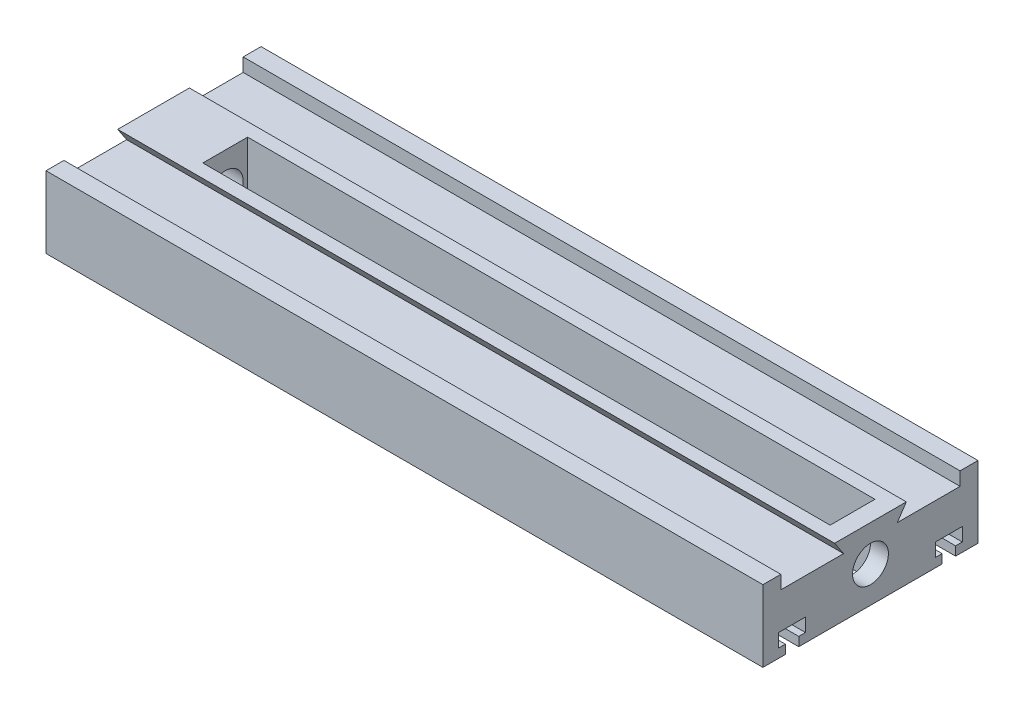
ISO-10303-21;
HEADER;
FILE_DESCRIPTION(('STEP AP214'),'2;1');
FILE_NAME('part.step','',(''),(''),'','','');
FILE_SCHEMA(('AUTOMOTIVE_DESIGN { 1 0 10303 214 1 1 1 1 }'));
ENDSEC;
DATA;
#1=APPLICATION_CONTEXT('core data for automotive mechanical design processes');
#2=APPLICATION_PROTOCOL_DEFINITION('international standard','automotive_design',2000,#1);
#3=PRODUCT_CONTEXT('',#1,'mechanical');
#4=PRODUCT('Part','Part','',(#3));
#5=PRODUCT_RELATED_PRODUCT_CATEGORY('part','',(#4));
#6=PRODUCT_DEFINITION_FORMATION('','',#4);
#7=PRODUCT_DEFINITION_CONTEXT('part definition',#1,'design');
#8=PRODUCT_DEFINITION('design','',#6,#7);
#9=PRODUCT_DEFINITION_SHAPE('','',#8);
#10=(LENGTH_UNIT() NAMED_UNIT(*) SI_UNIT(.MILLI.,.METRE.));
#11=(NAMED_UNIT(*) PLANE_ANGLE_UNIT() SI_UNIT($,.RADIAN.));
#12=(NAMED_UNIT(*) SI_UNIT($,.STERADIAN.) SOLID_ANGLE_UNIT());
#13=UNCERTAINTY_MEASURE_WITH_UNIT(LENGTH_MEASURE(1.E-05),#10,'distance_accuracy_value','');
#14=(GEOMETRIC_REPRESENTATION_CONTEXT(3) GLOBAL_UNCERTAINTY_ASSIGNED_CONTEXT((#13)) GLOBAL_UNIT_ASSIGNED_CONTEXT((#10,
#11,#12)) REPRESENTATION_CONTEXT('',''));
#15=CARTESIAN_POINT('',(0.,0.,0.));
#16=DIRECTION('',(0.,0.,1.));
#17=DIRECTION('',(1.,0.,0.));
#18=AXIS2_PLACEMENT_3D('',#15,#16,#17);
#19=CARTESIAN_POINT('',(-254.,0.,0.));
#20=DIRECTION('',(1.,0.,0.));
#21=DIRECTION('',(0.,0.,-1.));
#22=AXIS2_PLACEMENT_3D('',#19,#20,#21);
#23=CYLINDRICAL_SURFACE('',#22,12.7);
#24=CARTESIAN_POINT('',(-203.2,0.,0.));
#25=DIRECTION('',(-1.,0.,0.));
#26=DIRECTION('',(0.,0.,1.));
#27=AXIS2_PLACEMENT_3D('',#24,#25,#26);
#28=CIRCLE('',#27,12.7);
#29=CARTESIAN_POINT('',(-203.2,0.,12.7));
#30=VERTEX_POINT('',#29);
#31=EDGE_CURVE('E36',#30,#30,#28,.F.);
#32=ORIENTED_EDGE('',*,*,#31,.T.);
#33=EDGE_LOOP('',(#32));
#34=FACE_BOUND('',#33,.T.);
#35=CARTESIAN_POINT('',(-254.,0.,0.));
#36=DIRECTION('',(1.,0.,0.));
#37=DIRECTION('',(0.,0.,-1.));
#38=AXIS2_PLACEMENT_3D('',#35,#36,#37);
#39=CIRCLE('',#38,12.7);
#40=CARTESIAN_POINT('',(-254.,0.,-12.7));
#41=VERTEX_POINT('',#40);
#42=EDGE_CURVE('E332',#41,#41,#39,.T.);
#43=ORIENTED_EDGE('',*,*,#42,.F.);
#44=EDGE_LOOP('',(#43));
#45=FACE_BOUND('',#44,.T.);
#46=ADVANCED_FACE('F32',(#34,#45),#23,.F.);
#47=CARTESIAN_POINT('',(254.,25.4,76.2));
#48=DIRECTION('',(0.,-1.,0.));
#49=DIRECTION('',(0.,0.,-1.));
#50=AXIS2_PLACEMENT_3D('',#47,#48,#49);
#51=PLANE('',#50);
#52=DIRECTION('',(0.,0.,1.));
#53=VECTOR('',#52,1.);
#54=CARTESIAN_POINT('',(-254.,25.4,76.2));
#55=LINE('',#54,#53);
#56=CARTESIAN_POINT('',(-254.,25.4,-76.2));
#57=VERTEX_POINT('',#56);
#58=CARTESIAN_POINT('',(-254.,25.4,-63.5));
#59=VERTEX_POINT('',#58);
#60=EDGE_CURVE('E474',#57,#59,#55,.T.);
#61=ORIENTED_EDGE('',*,*,#60,.T.);
#62=DIRECTION('',(1.,0.,0.));
#63=VECTOR('',#62,1.);
#64=CARTESIAN_POINT('',(254.,25.4,-63.5));
#65=LINE('',#64,#63);
#66=CARTESIAN_POINT('',(254.,25.4,-63.5));
#67=VERTEX_POINT('',#66);
#68=EDGE_CURVE('E328',#59,#67,#65,.T.);
#69=ORIENTED_EDGE('',*,*,#68,.T.);
#70=DIRECTION('',(0.,0.,1.));
#71=VECTOR('',#70,1.);
#72=CARTESIAN_POINT('',(254.,25.4,76.2));
#73=LINE('',#72,#71);
#74=CARTESIAN_POINT('',(254.,25.4,-76.2));
#75=VERTEX_POINT('',#74);
#76=EDGE_CURVE('E459',#75,#67,#73,.T.);
#77=ORIENTED_EDGE('',*,*,#76,.F.);
#78=DIRECTION('',(-1.,0.,0.));
#79=VECTOR('',#78,1.);
#80=CARTESIAN_POINT('',(254.,25.4,-76.2));
#81=LINE('',#80,#79);
#82=EDGE_CURVE('E41',#75,#57,#81,.T.);
#83=ORIENTED_EDGE('',*,*,#82,.T.);
#84=EDGE_LOOP('',(#61,#69,#77,#83));
#85=FACE_BOUND('',#84,.T.);
#86=ADVANCED_FACE('F517',(#85),#51,.F.);
#87=DIRECTION('',(1.,0.,0.));
#88=VECTOR('',#87,1.);
#89=CARTESIAN_POINT('',(-203.2,25.4,15.875));
#90=LINE('',#89,#88);
#91=CARTESIAN_POINT('',(-203.2,25.4,15.875));
#92=VERTEX_POINT('',#91);
#93=CARTESIAN_POINT('',(241.3,25.4,15.875));
#94=VERTEX_POINT('',#93);
#95=EDGE_CURVE('E271',#92,#94,#90,.T.);
#96=ORIENTED_EDGE('',*,*,#95,.F.);
#97=DIRECTION('',(0.,0.,1.));
#98=VECTOR('',#97,1.);
#99=CARTESIAN_POINT('',(-203.2,25.4,15.875));
#100=LINE('',#99,#98);
#101=CARTESIAN_POINT('',(-203.2,25.4,-15.875));
#102=VERTEX_POINT('',#101);
#103=EDGE_CURVE('E49',#102,#92,#100,.T.);
#104=ORIENTED_EDGE('',*,*,#103,.F.);
#105=DIRECTION('',(-1.,0.,0.));
#106=VECTOR('',#105,1.);
#107=CARTESIAN_POINT('',(-203.2,25.4,-15.875));
#108=LINE('',#107,#106);
#109=CARTESIAN_POINT('',(241.3,25.4,-15.875));
#110=VERTEX_POINT('',#109);
#111=EDGE_CURVE('E262',#110,#102,#108,.T.);
#112=ORIENTED_EDGE('',*,*,#111,.F.);
#113=DIRECTION('',(0.,0.,-1.));
#114=VECTOR('',#113,1.);
#115=CARTESIAN_POINT('',(241.3,25.4,15.875));
#116=LINE('',#115,#114);
#117=EDGE_CURVE('E265',#94,#110,#116,.T.);
#118=ORIENTED_EDGE('',*,*,#117,.F.);
#119=EDGE_LOOP('',(#96,#104,#112,#118));
#120=FACE_BOUND('',#119,.T.);
#121=CARTESIAN_POINT('',(254.,25.4,-25.4));
#122=VERTEX_POINT('',#121);
#123=CARTESIAN_POINT('',(254.,25.4,25.4));
#124=VERTEX_POINT('',#123);
#125=EDGE_CURVE('E463',#122,#124,#73,.T.);
#126=ORIENTED_EDGE('',*,*,#125,.F.);
#127=DIRECTION('',(1.,0.,0.));
#128=VECTOR('',#127,1.);
#129=CARTESIAN_POINT('',(-254.,25.4,-25.4));
#130=LINE('',#129,#128);
#131=CARTESIAN_POINT('',(-254.,25.4,-25.4));
#132=VERTEX_POINT('',#131);
#133=EDGE_CURVE('E317',#132,#122,#130,.T.);
#134=ORIENTED_EDGE('',*,*,#133,.F.);
#135=CARTESIAN_POINT('',(-254.,25.4,25.4));
#136=VERTEX_POINT('',#135);
#137=EDGE_CURVE('E478',#132,#136,#55,.T.);
#138=ORIENTED_EDGE('',*,*,#137,.T.);
#139=DIRECTION('',(1.,0.,0.));
#140=VECTOR('',#139,1.);
#141=CARTESIAN_POINT('',(-254.,25.4,25.4));
#142=LINE('',#141,#140);
#143=EDGE_CURVE('E319',#136,#124,#142,.T.);
#144=ORIENTED_EDGE('',*,*,#143,.T.);
#145=EDGE_LOOP('',(#126,#134,#138,#144));
#146=FACE_BOUND('',#145,.T.);
#147=ADVANCED_FACE('F524',(#120,#146),#51,.F.);
#148=CARTESIAN_POINT('',(254.,-25.4,76.2));
#149=DIRECTION('',(0.,1.,0.));
#150=DIRECTION('',(0.,0.,1.));
#151=AXIS2_PLACEMENT_3D('',#148,#149,#150);
#152=PLANE('',#151);
#153=DIRECTION('',(-1.,0.,0.));
#154=VECTOR('',#153,1.);
#155=CARTESIAN_POINT('',(-203.2,-25.4,-15.875));
#156=LINE('',#155,#154);
#157=CARTESIAN_POINT('',(241.3,-25.4,-15.875));
#158=VERTEX_POINT('',#157);
#159=CARTESIAN_POINT('',(-203.2,-25.4,-15.875));
#160=VERTEX_POINT('',#159);
#161=EDGE_CURVE('E252',#158,#160,#156,.T.);
#162=ORIENTED_EDGE('',*,*,#161,.T.);
#163=DIRECTION('',(0.,0.,1.));
#164=VECTOR('',#163,1.);
#165=CARTESIAN_POINT('',(-203.2,-25.4,15.875));
#166=LINE('',#165,#164);
#167=CARTESIAN_POINT('',(-203.2,-25.4,15.875));
#168=VERTEX_POINT('',#167);
#169=EDGE_CURVE('E246',#160,#168,#166,.T.);
#170=ORIENTED_EDGE('',*,*,#169,.T.);
#171=DIRECTION('',(1.,0.,0.));
#172=VECTOR('',#171,1.);
#173=CARTESIAN_POINT('',(-203.2,-25.4,15.875));
#174=LINE('',#173,#172);
#175=CARTESIAN_POINT('',(241.3,-25.4,15.875));
#176=VERTEX_POINT('',#175);
#177=EDGE_CURVE('E255',#168,#176,#174,.T.);
#178=ORIENTED_EDGE('',*,*,#177,.T.);
#179=DIRECTION('',(0.,0.,-1.));
#180=VECTOR('',#179,1.);
#181=CARTESIAN_POINT('',(241.3,-25.4,15.875));
#182=LINE('',#181,#180);
#183=EDGE_CURVE('E57',#176,#158,#182,.T.);
#184=ORIENTED_EDGE('',*,*,#183,.T.);
#185=EDGE_LOOP('',(#162,#170,#178,#184));
#186=FACE_BOUND('',#185,.T.);
#187=DIRECTION('',(0.,0.,-1.));
#188=VECTOR('',#187,1.);
#189=CARTESIAN_POINT('',(-254.,-25.4,76.2));
#190=LINE('',#189,#188);
#191=CARTESIAN_POINT('',(-254.,-25.4,50.8));
#192=VERTEX_POINT('',#191);
#193=CARTESIAN_POINT('',(-254.,-25.4,-50.8));
#194=VERTEX_POINT('',#193);
#195=EDGE_CURVE('E483',#192,#194,#190,.T.);
#196=ORIENTED_EDGE('',*,*,#195,.T.);
#197=DIRECTION('',(1.,0.,0.));
#198=VECTOR('',#197,1.);
#199=CARTESIAN_POINT('',(-254.,-25.4,-50.8));
#200=LINE('',#199,#198);
#201=CARTESIAN_POINT('',(254.,-25.4,-50.8));
#202=VERTEX_POINT('',#201);
#203=EDGE_CURVE('E360',#194,#202,#200,.T.);
#204=ORIENTED_EDGE('',*,*,#203,.T.);
#205=DIRECTION('',(0.,0.,-1.));
#206=VECTOR('',#205,1.);
#207=CARTESIAN_POINT('',(254.,-25.4,76.2));
#208=LINE('',#207,#206);
#209=CARTESIAN_POINT('',(254.,-25.4,50.8));
#210=VERTEX_POINT('',#209);
#211=EDGE_CURVE('E470',#210,#202,#208,.T.);
#212=ORIENTED_EDGE('',*,*,#211,.F.);
#213=DIRECTION('',(1.,0.,0.));
#214=VECTOR('',#213,1.);
#215=CARTESIAN_POINT('',(-254.,-25.4,50.8));
#216=LINE('',#215,#214);
#217=EDGE_CURVE('E418',#192,#210,#216,.T.);
#218=ORIENTED_EDGE('',*,*,#217,.F.);
#219=EDGE_LOOP('',(#196,#204,#212,#218));
#220=FACE_BOUND('',#219,.T.);
#221=ADVANCED_FACE('F259',(#186,#220),#152,.F.);
#222=CARTESIAN_POINT('',(-254.,-25.4,76.2));
#223=VERTEX_POINT('',#222);
#224=CARTESIAN_POINT('',(-254.,-25.4,60.325));
#225=VERTEX_POINT('',#224);
#226=EDGE_CURVE('E458',#223,#225,#190,.T.);
#227=ORIENTED_EDGE('',*,*,#226,.T.);
#228=DIRECTION('',(1.,0.,0.));
#229=VECTOR('',#228,1.);
#230=CARTESIAN_POINT('',(-254.,-25.4,60.325));
#231=LINE('',#230,#229);
#232=CARTESIAN_POINT('',(254.,-25.4,60.325));
#233=VERTEX_POINT('',#232);
#234=EDGE_CURVE('E437',#225,#233,#231,.T.);
#235=ORIENTED_EDGE('',*,*,#234,.T.);
#236=CARTESIAN_POINT('',(254.,-25.4,76.2));
#237=VERTEX_POINT('',#236);
#238=EDGE_CURVE('E466',#237,#233,#208,.T.);
#239=ORIENTED_EDGE('',*,*,#238,.F.);
#240=DIRECTION('',(-1.,0.,0.));
#241=VECTOR('',#240,1.);
#242=CARTESIAN_POINT('',(254.,-25.4,76.2));
#243=LINE('',#242,#241);
#244=EDGE_CURVE('E486',#237,#223,#243,.T.);
#245=ORIENTED_EDGE('',*,*,#244,.T.);
#246=EDGE_LOOP('',(#227,#235,#239,#245));
#247=FACE_BOUND('',#246,.T.);
#248=ADVANCED_FACE('F563',(#247),#152,.F.);
#249=CARTESIAN_POINT('',(254.,25.4,-76.2));
#250=DIRECTION('',(0.,0.,1.));
#251=DIRECTION('',(0.,-1.,0.));
#252=AXIS2_PLACEMENT_3D('',#249,#250,#251);
#253=PLANE('',#252);
#254=DIRECTION('',(0.,1.,0.));
#255=VECTOR('',#254,1.);
#256=CARTESIAN_POINT('',(-254.,25.4,-76.2));
#257=LINE('',#256,#255);
#258=CARTESIAN_POINT('',(-254.,-25.4,-76.2));
#259=VERTEX_POINT('',#258);
#260=EDGE_CURVE('E440',#259,#57,#257,.T.);
#261=ORIENTED_EDGE('',*,*,#260,.T.);
#262=ORIENTED_EDGE('',*,*,#82,.F.);
#263=DIRECTION('',(0.,1.,0.));
#264=VECTOR('',#263,1.);
#265=CARTESIAN_POINT('',(254.,25.4,-76.2));
#266=LINE('',#265,#264);
#267=CARTESIAN_POINT('',(254.,-25.4,-76.2));
#268=VERTEX_POINT('',#267);
#269=EDGE_CURVE('E454',#268,#75,#266,.T.);
#270=ORIENTED_EDGE('',*,*,#269,.F.);
#271=DIRECTION('',(-1.,0.,0.));
#272=VECTOR('',#271,1.);
#273=CARTESIAN_POINT('',(254.,-25.4,-76.2));
#274=LINE('',#273,#272);
#275=EDGE_CURVE('E469',#268,#259,#274,.T.);
#276=ORIENTED_EDGE('',*,*,#275,.T.);
#277=EDGE_LOOP('',(#261,#262,#270,#276));
#278=FACE_BOUND('',#277,.T.);
#279=ADVANCED_FACE('F34',(#278),#253,.F.);
#280=CARTESIAN_POINT('',(254.,25.4,63.5000000000001));
#281=VERTEX_POINT('',#280);
#282=CARTESIAN_POINT('',(254.,25.4,76.2));
#283=VERTEX_POINT('',#282);
#284=EDGE_CURVE('E457',#281,#283,#73,.T.);
#285=ORIENTED_EDGE('',*,*,#284,.F.);
#286=DIRECTION('',(-1.,0.,0.));
#287=VECTOR('',#286,1.);
#288=CARTESIAN_POINT('',(254.,25.4,63.5000000000001));
#289=LINE('',#288,#287);
#290=CARTESIAN_POINT('',(-254.,25.4,63.5000000000001));
#291=VERTEX_POINT('',#290);
#292=EDGE_CURVE('E314',#281,#291,#289,.T.);
#293=ORIENTED_EDGE('',*,*,#292,.T.);
#294=CARTESIAN_POINT('',(-254.,25.4,76.2));
#295=VERTEX_POINT('',#294);
#296=EDGE_CURVE('E473',#291,#295,#55,.T.);
#297=ORIENTED_EDGE('',*,*,#296,.T.);
#298=DIRECTION('',(-1.,0.,0.));
#299=VECTOR('',#298,1.);
#300=CARTESIAN_POINT('',(254.,25.4,76.2));
#301=LINE('',#300,#299);
#302=EDGE_CURVE('E489',#283,#295,#301,.T.);
#303=ORIENTED_EDGE('',*,*,#302,.F.);
#304=EDGE_LOOP('',(#285,#293,#297,#303));
#305=FACE_BOUND('',#304,.T.);
#306=ADVANCED_FACE('F526',(#305),#51,.F.);
#307=CARTESIAN_POINT('',(254.,25.4,76.2));
#308=DIRECTION('',(0.,0.,-1.));
#309=DIRECTION('',(-1.,0.,0.));
#310=AXIS2_PLACEMENT_3D('',#307,#308,#309);
#311=PLANE('',#310);
#312=DIRECTION('',(0.,-1.,0.));
#313=VECTOR('',#312,1.);
#314=CARTESIAN_POINT('',(-254.,25.4,76.2));
#315=LINE('',#314,#313);
#316=EDGE_CURVE('E477',#295,#223,#315,.T.);
#317=ORIENTED_EDGE('',*,*,#316,.T.);
#318=ORIENTED_EDGE('',*,*,#244,.F.);
#319=DIRECTION('',(0.,-1.,0.));
#320=VECTOR('',#319,1.);
#321=CARTESIAN_POINT('',(254.,25.4,76.2));
#322=LINE('',#321,#320);
#323=EDGE_CURVE('E462',#283,#237,#322,.T.);
#324=ORIENTED_EDGE('',*,*,#323,.F.);
#325=ORIENTED_EDGE('',*,*,#302,.T.);
#326=EDGE_LOOP('',(#317,#318,#324,#325));
#327=FACE_BOUND('',#326,.T.);
#328=ADVANCED_FACE('F560',(#327),#311,.F.);
#329=CARTESIAN_POINT('',(254.,-25.4,-60.325));
#330=VERTEX_POINT('',#329);
#331=EDGE_CURVE('E465',#330,#268,#208,.T.);
#332=ORIENTED_EDGE('',*,*,#331,.F.);
#333=DIRECTION('',(1.,0.,0.));
#334=VECTOR('',#333,1.);
#335=CARTESIAN_POINT('',(-254.,-25.4,-60.325));
#336=LINE('',#335,#334);
#337=CARTESIAN_POINT('',(-254.,-25.4,-60.325));
#338=VERTEX_POINT('',#337);
#339=EDGE_CURVE('E392',#338,#330,#336,.T.);
#340=ORIENTED_EDGE('',*,*,#339,.F.);
#341=EDGE_CURVE('E480',#338,#259,#190,.T.);
#342=ORIENTED_EDGE('',*,*,#341,.T.);
#343=ORIENTED_EDGE('',*,*,#275,.F.);
#344=EDGE_LOOP('',(#332,#340,#342,#343));
#345=FACE_BOUND('',#344,.T.);
#346=ADVANCED_FACE('F549',(#345),#152,.F.);
#347=CARTESIAN_POINT('',(254.,0.,0.));
#348=DIRECTION('',(1.,0.,0.));
#349=DIRECTION('',(0.,0.,-1.));
#350=AXIS2_PLACEMENT_3D('',#347,#348,#349);
#351=PLANE('',#350);
#352=DIRECTION('',(0.,1.,0.));
#353=VECTOR('',#352,1.);
#354=CARTESIAN_POINT('',(254.,34.925,-63.5));
#355=LINE('',#354,#353);
#356=CARTESIAN_POINT('',(254.,15.875,-63.5));
#357=VERTEX_POINT('',#356);
#358=EDGE_CURVE('E285',#357,#67,#355,.T.);
#359=ORIENTED_EDGE('',*,*,#358,.F.);
#360=DIRECTION('',(0.,0.,-1.));
#361=VECTOR('',#360,1.);
#362=CARTESIAN_POINT('',(254.,15.875,-19.05));
#363=LINE('',#362,#361);
#364=CARTESIAN_POINT('',(254.,15.875,-19.05));
#365=VERTEX_POINT('',#364);
#366=EDGE_CURVE('E308',#365,#357,#363,.T.);
#367=ORIENTED_EDGE('',*,*,#366,.F.);
#368=DIRECTION('',(0.,-0.832050294337844,0.554700196225229));
#369=VECTOR('',#368,1.);
#370=CARTESIAN_POINT('',(254.,25.4,-25.4));
#371=LINE('',#370,#369);
#372=EDGE_CURVE('E305',#122,#365,#371,.T.);
#373=ORIENTED_EDGE('',*,*,#372,.F.);
#374=ORIENTED_EDGE('',*,*,#125,.T.);
#375=DIRECTION('',(0.,0.832050294337844,0.554700196225229));
#376=VECTOR('',#375,1.);
#377=CARTESIAN_POINT('',(254.,15.875,19.05));
#378=LINE('',#377,#376);
#379=CARTESIAN_POINT('',(254.,15.875,19.05));
#380=VERTEX_POINT('',#379);
#381=EDGE_CURVE('E303',#380,#124,#378,.T.);
#382=ORIENTED_EDGE('',*,*,#381,.F.);
#383=DIRECTION('',(0.,0.,-1.));
#384=VECTOR('',#383,1.);
#385=CARTESIAN_POINT('',(254.,15.875,63.5000000000001));
#386=LINE('',#385,#384);
#387=CARTESIAN_POINT('',(254.,15.875,63.5000000000001));
#388=VERTEX_POINT('',#387);
#389=EDGE_CURVE('E300',#388,#380,#386,.T.);
#390=ORIENTED_EDGE('',*,*,#389,.F.);
#391=DIRECTION('',(0.,-1.,0.));
#392=VECTOR('',#391,1.);
#393=CARTESIAN_POINT('',(254.,25.4,63.5000000000001));
#394=LINE('',#393,#392);
#395=EDGE_CURVE('E298',#281,#388,#394,.T.);
#396=ORIENTED_EDGE('',*,*,#395,.F.);
#397=ORIENTED_EDGE('',*,*,#284,.T.);
#398=ORIENTED_EDGE('',*,*,#323,.T.);
#399=ORIENTED_EDGE('',*,*,#238,.T.);
#400=DIRECTION('',(0.,-1.,0.));
#401=VECTOR('',#400,1.);
#402=CARTESIAN_POINT('',(254.,-25.4,60.325));
#403=LINE('',#402,#401);
#404=CARTESIAN_POINT('',(254.,-19.05,60.325));
#405=VERTEX_POINT('',#404);
#406=EDGE_CURVE('E400',#405,#233,#403,.T.);
#407=ORIENTED_EDGE('',*,*,#406,.F.);
#408=DIRECTION('',(0.,0.,-1.));
#409=VECTOR('',#408,1.);
#410=CARTESIAN_POINT('',(254.,-19.05,60.325));
#411=LINE('',#410,#409);
#412=CARTESIAN_POINT('',(254.,-19.05,65.0875));
#413=VERTEX_POINT('',#412);
#414=EDGE_CURVE('E433',#413,#405,#411,.T.);
#415=ORIENTED_EDGE('',*,*,#414,.F.);
#416=DIRECTION('',(0.,-1.,0.));
#417=VECTOR('',#416,1.);
#418=CARTESIAN_POINT('',(254.,-19.05,65.0875));
#419=LINE('',#418,#417);
#420=CARTESIAN_POINT('',(254.,-9.52499999999998,65.0875));
#421=VERTEX_POINT('',#420);
#422=EDGE_CURVE('E430',#421,#413,#419,.T.);
#423=ORIENTED_EDGE('',*,*,#422,.F.);
#424=DIRECTION('',(0.,0.,1.));
#425=VECTOR('',#424,1.);
#426=CARTESIAN_POINT('',(254.,-9.52499999999998,65.0875));
#427=LINE('',#426,#425);
#428=CARTESIAN_POINT('',(254.,-9.52499999999998,46.0375));
#429=VERTEX_POINT('',#428);
#430=EDGE_CURVE('E427',#429,#421,#427,.T.);
#431=ORIENTED_EDGE('',*,*,#430,.F.);
#432=DIRECTION('',(0.,1.,0.));
#433=VECTOR('',#432,1.);
#434=CARTESIAN_POINT('',(254.,-9.52499999999998,46.0375));
#435=LINE('',#434,#433);
#436=CARTESIAN_POINT('',(254.,-19.05,46.0375));
#437=VERTEX_POINT('',#436);
#438=EDGE_CURVE('E424',#437,#429,#435,.T.);
#439=ORIENTED_EDGE('',*,*,#438,.F.);
#440=DIRECTION('',(0.,0.,-1.));
#441=VECTOR('',#440,1.);
#442=CARTESIAN_POINT('',(254.,-19.05,46.0375));
#443=LINE('',#442,#441);
#444=CARTESIAN_POINT('',(254.,-19.05,50.8));
#445=VERTEX_POINT('',#444);
#446=EDGE_CURVE('E421',#445,#437,#443,.T.);
#447=ORIENTED_EDGE('',*,*,#446,.F.);
#448=DIRECTION('',(0.,1.,0.));
#449=VECTOR('',#448,1.);
#450=CARTESIAN_POINT('',(254.,-19.05,50.8));
#451=LINE('',#450,#449);
#452=EDGE_CURVE('E381',#210,#445,#451,.T.);
#453=ORIENTED_EDGE('',*,*,#452,.F.);
#454=ORIENTED_EDGE('',*,*,#211,.T.);
#455=DIRECTION('',(0.,-1.,0.));
#456=VECTOR('',#455,1.);
#457=CARTESIAN_POINT('',(254.,-19.05,-50.8));
#458=LINE('',#457,#456);
#459=CARTESIAN_POINT('',(254.,-19.05,-50.8));
#460=VERTEX_POINT('',#459);
#461=EDGE_CURVE('E335',#460,#202,#458,.T.);
#462=ORIENTED_EDGE('',*,*,#461,.F.);
#463=DIRECTION('',(0.,0.,-1.));
#464=VECTOR('',#463,1.);
#465=CARTESIAN_POINT('',(254.,-19.05,-46.0375));
#466=LINE('',#465,#464);
#467=CARTESIAN_POINT('',(254.,-19.05,-46.0375));
#468=VERTEX_POINT('',#467);
#469=EDGE_CURVE('E342',#468,#460,#466,.T.);
#470=ORIENTED_EDGE('',*,*,#469,.F.);
#471=DIRECTION('',(0.,-1.,0.));
#472=VECTOR('',#471,1.);
#473=CARTESIAN_POINT('',(254.,-9.52499999999997,-46.0375));
#474=LINE('',#473,#472);
#475=CARTESIAN_POINT('',(254.,-9.52499999999997,-46.0375));
#476=VERTEX_POINT('',#475);
#477=EDGE_CURVE('E374',#476,#468,#474,.T.);
#478=ORIENTED_EDGE('',*,*,#477,.F.);
#479=DIRECTION('',(0.,0.,1.));
#480=VECTOR('',#479,1.);
#481=CARTESIAN_POINT('',(254.,-9.52499999999997,-65.0875));
#482=LINE('',#481,#480);
#483=CARTESIAN_POINT('',(254.,-9.52499999999997,-65.0875));
#484=VERTEX_POINT('',#483);
#485=EDGE_CURVE('E371',#484,#476,#482,.T.);
#486=ORIENTED_EDGE('',*,*,#485,.F.);
#487=DIRECTION('',(0.,1.,0.));
#488=VECTOR('',#487,1.);
#489=CARTESIAN_POINT('',(254.,-19.05,-65.0875));
#490=LINE('',#489,#488);
#491=CARTESIAN_POINT('',(254.,-19.05,-65.0875));
#492=VERTEX_POINT('',#491);
#493=EDGE_CURVE('E368',#492,#484,#490,.T.);
#494=ORIENTED_EDGE('',*,*,#493,.F.);
#495=DIRECTION('',(0.,0.,-1.));
#496=VECTOR('',#495,1.);
#497=CARTESIAN_POINT('',(254.,-19.05,-60.325));
#498=LINE('',#497,#496);
#499=CARTESIAN_POINT('',(254.,-19.05,-60.325));
#500=VERTEX_POINT('',#499);
#501=EDGE_CURVE('E365',#500,#492,#498,.T.);
#502=ORIENTED_EDGE('',*,*,#501,.F.);
#503=DIRECTION('',(0.,1.,0.));
#504=VECTOR('',#503,1.);
#505=CARTESIAN_POINT('',(254.,-25.4,-60.325));
#506=LINE('',#505,#504);
#507=EDGE_CURVE('E362',#330,#500,#506,.T.);
#508=ORIENTED_EDGE('',*,*,#507,.F.);
#509=ORIENTED_EDGE('',*,*,#331,.T.);
#510=ORIENTED_EDGE('',*,*,#269,.T.);
#511=ORIENTED_EDGE('',*,*,#76,.T.);
#512=EDGE_LOOP('',(#359,#367,#373,#374,#382,#390,#396,#397,#398,#399,#407,#415,#423,#431,#439,
#447,#453,#454,#462,#470,#478,#486,#494,#502,#508,#509,#510,#511));
#513=FACE_BOUND('',#512,.T.);
#514=CARTESIAN_POINT('',(254.,0.,0.));
#515=DIRECTION('',(1.,0.,0.));
#516=DIRECTION('',(0.,0.,-1.));
#517=AXIS2_PLACEMENT_3D('',#514,#515,#516);
#518=CIRCLE('',#517,12.7);
#519=CARTESIAN_POINT('',(254.,0.,-12.7));
#520=VERTEX_POINT('',#519);
#521=EDGE_CURVE('E331',#520,#520,#518,.T.);
#522=ORIENTED_EDGE('',*,*,#521,.F.);
#523=EDGE_LOOP('',(#522));
#524=FACE_BOUND('',#523,.T.);
#525=ADVANCED_FACE('F546',(#513,#524),#351,.T.);
#526=CARTESIAN_POINT('',(-254.,0.,0.));
#527=DIRECTION('',(1.,0.,0.));
#528=DIRECTION('',(0.,0.,-1.));
#529=AXIS2_PLACEMENT_3D('',#526,#527,#528);
#530=PLANE('',#529);
#531=ORIENTED_EDGE('',*,*,#42,.T.);
#532=EDGE_LOOP('',(#531));
#533=FACE_BOUND('',#532,.T.);
#534=DIRECTION('',(0.,0.,-1.));
#535=VECTOR('',#534,1.);
#536=CARTESIAN_POINT('',(-254.,15.875,-19.05));
#537=LINE('',#536,#535);
#538=CARTESIAN_POINT('',(-254.,15.875,-19.05));
#539=VERTEX_POINT('',#538);
#540=CARTESIAN_POINT('',(-254.,15.875,-63.5));
#541=VERTEX_POINT('',#540);
#542=EDGE_CURVE('E291',#539,#541,#537,.T.);
#543=ORIENTED_EDGE('',*,*,#542,.T.);
#544=DIRECTION('',(0.,1.,0.));
#545=VECTOR('',#544,1.);
#546=CARTESIAN_POINT('',(-254.,15.875,-63.5));
#547=LINE('',#546,#545);
#548=EDGE_CURVE('E294',#541,#59,#547,.T.);
#549=ORIENTED_EDGE('',*,*,#548,.T.);
#550=ORIENTED_EDGE('',*,*,#60,.F.);
#551=ORIENTED_EDGE('',*,*,#260,.F.);
#552=ORIENTED_EDGE('',*,*,#341,.F.);
#553=DIRECTION('',(0.,1.,0.));
#554=VECTOR('',#553,1.);
#555=CARTESIAN_POINT('',(-254.,-25.4,-60.325));
#556=LINE('',#555,#554);
#557=CARTESIAN_POINT('',(-254.,-19.05,-60.325));
#558=VERTEX_POINT('',#557);
#559=EDGE_CURVE('E341',#338,#558,#556,.T.);
#560=ORIENTED_EDGE('',*,*,#559,.T.);
#561=DIRECTION('',(0.,0.,-1.));
#562=VECTOR('',#561,1.);
#563=CARTESIAN_POINT('',(-254.,-19.05,-60.325));
#564=LINE('',#563,#562);
#565=CARTESIAN_POINT('',(-254.,-19.05,-65.0875));
#566=VERTEX_POINT('',#565);
#567=EDGE_CURVE('E345',#558,#566,#564,.T.);
#568=ORIENTED_EDGE('',*,*,#567,.T.);
#569=DIRECTION('',(0.,1.,0.));
#570=VECTOR('',#569,1.);
#571=CARTESIAN_POINT('',(-254.,-19.05,-65.0875));
#572=LINE('',#571,#570);
#573=CARTESIAN_POINT('',(-254.,-9.52499999999997,-65.0875));
#574=VERTEX_POINT('',#573);
#575=EDGE_CURVE('E348',#566,#574,#572,.T.);
#576=ORIENTED_EDGE('',*,*,#575,.T.);
#577=DIRECTION('',(0.,0.,1.));
#578=VECTOR('',#577,1.);
#579=CARTESIAN_POINT('',(-254.,-9.52499999999997,-65.0875));
#580=LINE('',#579,#578);
#581=CARTESIAN_POINT('',(-254.,-9.52499999999997,-46.0375));
#582=VERTEX_POINT('',#581);
#583=EDGE_CURVE('E351',#574,#582,#580,.T.);
#584=ORIENTED_EDGE('',*,*,#583,.T.);
#585=DIRECTION('',(0.,-1.,0.));
#586=VECTOR('',#585,1.);
#587=CARTESIAN_POINT('',(-254.,-9.52499999999997,-46.0375));
#588=LINE('',#587,#586);
#589=CARTESIAN_POINT('',(-254.,-19.05,-46.0375));
#590=VERTEX_POINT('',#589);
#591=EDGE_CURVE('E354',#582,#590,#588,.T.);
#592=ORIENTED_EDGE('',*,*,#591,.T.);
#593=DIRECTION('',(0.,0.,-1.));
#594=VECTOR('',#593,1.);
#595=CARTESIAN_POINT('',(-254.,-19.05,-46.0375));
#596=LINE('',#595,#594);
#597=CARTESIAN_POINT('',(-254.,-19.05,-50.8));
#598=VERTEX_POINT('',#597);
#599=EDGE_CURVE('E357',#590,#598,#596,.T.);
#600=ORIENTED_EDGE('',*,*,#599,.T.);
#601=DIRECTION('',(0.,-1.,0.));
#602=VECTOR('',#601,1.);
#603=CARTESIAN_POINT('',(-254.,-19.05,-50.8));
#604=LINE('',#603,#602);
#605=EDGE_CURVE('E338',#598,#194,#604,.T.);
#606=ORIENTED_EDGE('',*,*,#605,.T.);
#607=ORIENTED_EDGE('',*,*,#195,.F.);
#608=DIRECTION('',(0.,1.,0.));
#609=VECTOR('',#608,1.);
#610=CARTESIAN_POINT('',(-254.,-19.05,50.8));
#611=LINE('',#610,#609);
#612=CARTESIAN_POINT('',(-254.,-19.05,50.8));
#613=VERTEX_POINT('',#612);
#614=EDGE_CURVE('E396',#192,#613,#611,.T.);
#615=ORIENTED_EDGE('',*,*,#614,.T.);
#616=DIRECTION('',(0.,0.,-1.));
#617=VECTOR('',#616,1.);
#618=CARTESIAN_POINT('',(-254.,-19.05,46.0375));
#619=LINE('',#618,#617);
#620=CARTESIAN_POINT('',(-254.,-19.05,46.0375));
#621=VERTEX_POINT('',#620);
#622=EDGE_CURVE('E399',#613,#621,#619,.T.);
#623=ORIENTED_EDGE('',*,*,#622,.T.);
#624=DIRECTION('',(0.,1.,0.));
#625=VECTOR('',#624,1.);
#626=CARTESIAN_POINT('',(-254.,-9.52499999999998,46.0375));
#627=LINE('',#626,#625);
#628=CARTESIAN_POINT('',(-254.,-9.52499999999998,46.0375));
#629=VERTEX_POINT('',#628);
#630=EDGE_CURVE('E403',#621,#629,#627,.T.);
#631=ORIENTED_EDGE('',*,*,#630,.T.);
#632=DIRECTION('',(0.,0.,1.));
#633=VECTOR('',#632,1.);
#634=CARTESIAN_POINT('',(-254.,-9.52499999999998,65.0875));
#635=LINE('',#634,#633);
#636=CARTESIAN_POINT('',(-254.,-9.52499999999998,65.0875));
#637=VERTEX_POINT('',#636);
#638=EDGE_CURVE('E406',#629,#637,#635,.T.);
#639=ORIENTED_EDGE('',*,*,#638,.T.);
#640=DIRECTION('',(0.,-1.,0.));
#641=VECTOR('',#640,1.);
#642=CARTESIAN_POINT('',(-254.,-19.05,65.0875));
#643=LINE('',#642,#641);
#644=CARTESIAN_POINT('',(-254.,-19.05,65.0875));
#645=VERTEX_POINT('',#644);
#646=EDGE_CURVE('E409',#637,#645,#643,.T.);
#647=ORIENTED_EDGE('',*,*,#646,.T.);
#648=DIRECTION('',(0.,0.,-1.));
#649=VECTOR('',#648,1.);
#650=CARTESIAN_POINT('',(-254.,-19.05,60.325));
#651=LINE('',#650,#649);
#652=CARTESIAN_POINT('',(-254.,-19.05,60.325));
#653=VERTEX_POINT('',#652);
#654=EDGE_CURVE('E412',#645,#653,#651,.T.);
#655=ORIENTED_EDGE('',*,*,#654,.T.);
#656=DIRECTION('',(0.,-1.,0.));
#657=VECTOR('',#656,1.);
#658=CARTESIAN_POINT('',(-254.,-25.4,60.325));
#659=LINE('',#658,#657);
#660=EDGE_CURVE('E415',#653,#225,#659,.T.);
#661=ORIENTED_EDGE('',*,*,#660,.T.);
#662=ORIENTED_EDGE('',*,*,#226,.F.);
#663=ORIENTED_EDGE('',*,*,#316,.F.);
#664=ORIENTED_EDGE('',*,*,#296,.F.);
#665=DIRECTION('',(0.,-1.,0.));
#666=VECTOR('',#665,1.);
#667=CARTESIAN_POINT('',(-254.,0.,63.5000000000001));
#668=LINE('',#667,#666);
#669=CARTESIAN_POINT('',(-254.,15.875,63.5000000000001));
#670=VERTEX_POINT('',#669);
#671=EDGE_CURVE('E11',#291,#670,#668,.T.);
#672=ORIENTED_EDGE('',*,*,#671,.T.);
#673=DIRECTION('',(0.,0.,-1.));
#674=VECTOR('',#673,1.);
#675=CARTESIAN_POINT('',(-254.,15.875,63.5000000000001));
#676=LINE('',#675,#674);
#677=CARTESIAN_POINT('',(-254.,15.875,19.05));
#678=VERTEX_POINT('',#677);
#679=EDGE_CURVE('E281',#670,#678,#676,.T.);
#680=ORIENTED_EDGE('',*,*,#679,.T.);
#681=DIRECTION('',(0.,0.832050294337844,0.554700196225229));
#682=VECTOR('',#681,1.);
#683=CARTESIAN_POINT('',(-254.,15.875,19.05));
#684=LINE('',#683,#682);
#685=EDGE_CURVE('E284',#678,#136,#684,.T.);
#686=ORIENTED_EDGE('',*,*,#685,.T.);
#687=ORIENTED_EDGE('',*,*,#137,.F.);
#688=DIRECTION('',(0.,-0.832050294337844,0.554700196225229));
#689=VECTOR('',#688,1.);
#690=CARTESIAN_POINT('',(-254.,25.4,-25.4));
#691=LINE('',#690,#689);
#692=EDGE_CURVE('E288',#132,#539,#691,.T.);
#693=ORIENTED_EDGE('',*,*,#692,.T.);
#694=EDGE_LOOP('',(#543,#549,#550,#551,#552,#560,#568,#576,#584,#592,#600,#606,#607,#615,#623,
#631,#639,#647,#655,#661,#662,#663,#664,#672,#680,#686,#687,#693));
#695=FACE_BOUND('',#694,.T.);
#696=ADVANCED_FACE('F548',(#533,#695),#530,.F.);
#697=CARTESIAN_POINT('',(-254.,-25.4,60.325));
#698=DIRECTION('',(0.,0.,1.));
#699=DIRECTION('',(1.,0.,0.));
#700=AXIS2_PLACEMENT_3D('',#697,#698,#699);
#701=PLANE('',#700);
#702=ORIENTED_EDGE('',*,*,#406,.T.);
#703=ORIENTED_EDGE('',*,*,#234,.F.);
#704=ORIENTED_EDGE('',*,*,#660,.F.);
#705=DIRECTION('',(1.,0.,0.));
#706=VECTOR('',#705,1.);
#707=CARTESIAN_POINT('',(-254.,-19.05,60.325));
#708=LINE('',#707,#706);
#709=EDGE_CURVE('E441',#653,#405,#708,.T.);
#710=ORIENTED_EDGE('',*,*,#709,.T.);
#711=EDGE_LOOP('',(#702,#703,#704,#710));
#712=FACE_BOUND('',#711,.T.);
#713=ADVANCED_FACE('F557',(#712),#701,.F.);
#714=CARTESIAN_POINT('',(-254.,-19.05,60.325));
#715=DIRECTION('',(0.,-1.,0.));
#716=DIRECTION('',(0.,0.,-1.));
#717=AXIS2_PLACEMENT_3D('',#714,#715,#716);
#718=PLANE('',#717);
#719=ORIENTED_EDGE('',*,*,#414,.T.);
#720=ORIENTED_EDGE('',*,*,#709,.F.);
#721=ORIENTED_EDGE('',*,*,#654,.F.);
#722=DIRECTION('',(1.,0.,0.));
#723=VECTOR('',#722,1.);
#724=CARTESIAN_POINT('',(-254.,-19.05,65.0875));
#725=LINE('',#724,#723);
#726=EDGE_CURVE('E443',#645,#413,#725,.T.);
#727=ORIENTED_EDGE('',*,*,#726,.T.);
#728=EDGE_LOOP('',(#719,#720,#721,#727));
#729=FACE_BOUND('',#728,.T.);
#730=ADVANCED_FACE('F611',(#729),#718,.F.);
#731=CARTESIAN_POINT('',(-254.,-19.05,65.0875));
#732=DIRECTION('',(0.,0.,1.));
#733=DIRECTION('',(1.,0.,0.));
#734=AXIS2_PLACEMENT_3D('',#731,#732,#733);
#735=PLANE('',#734);
#736=ORIENTED_EDGE('',*,*,#422,.T.);
#737=ORIENTED_EDGE('',*,*,#726,.F.);
#738=ORIENTED_EDGE('',*,*,#646,.F.);
#739=DIRECTION('',(1.,0.,0.));
#740=VECTOR('',#739,1.);
#741=CARTESIAN_POINT('',(-254.,-9.52499999999998,65.0875));
#742=LINE('',#741,#740);
#743=EDGE_CURVE('E445',#637,#421,#742,.T.);
#744=ORIENTED_EDGE('',*,*,#743,.T.);
#745=EDGE_LOOP('',(#736,#737,#738,#744));
#746=FACE_BOUND('',#745,.T.);
#747=ADVANCED_FACE('F614',(#746),#735,.F.);
#748=CARTESIAN_POINT('',(-254.,-9.52499999999998,65.0875));
#749=DIRECTION('',(0.,1.,0.));
#750=DIRECTION('',(0.,0.,1.));
#751=AXIS2_PLACEMENT_3D('',#748,#749,#750);
#752=PLANE('',#751);
#753=ORIENTED_EDGE('',*,*,#430,.T.);
#754=ORIENTED_EDGE('',*,*,#743,.F.);
#755=ORIENTED_EDGE('',*,*,#638,.F.);
#756=DIRECTION('',(1.,0.,0.));
#757=VECTOR('',#756,1.);
#758=CARTESIAN_POINT('',(-254.,-9.52499999999998,46.0375));
#759=LINE('',#758,#757);
#760=EDGE_CURVE('E447',#629,#429,#759,.T.);
#761=ORIENTED_EDGE('',*,*,#760,.T.);
#762=EDGE_LOOP('',(#753,#754,#755,#761));
#763=FACE_BOUND('',#762,.T.);
#764=ADVANCED_FACE('F619',(#763),#752,.F.);
#765=CARTESIAN_POINT('',(-254.,-9.52499999999998,46.0375));
#766=DIRECTION('',(0.,0.,-1.));
#767=DIRECTION('',(-1.,0.,0.));
#768=AXIS2_PLACEMENT_3D('',#765,#766,#767);
#769=PLANE('',#768);
#770=ORIENTED_EDGE('',*,*,#438,.T.);
#771=ORIENTED_EDGE('',*,*,#760,.F.);
#772=ORIENTED_EDGE('',*,*,#630,.F.);
#773=DIRECTION('',(1.,0.,0.));
#774=VECTOR('',#773,1.);
#775=CARTESIAN_POINT('',(-254.,-19.05,46.0375));
#776=LINE('',#775,#774);
#777=EDGE_CURVE('E449',#621,#437,#776,.T.);
#778=ORIENTED_EDGE('',*,*,#777,.T.);
#779=EDGE_LOOP('',(#770,#771,#772,#778));
#780=FACE_BOUND('',#779,.T.);
#781=ADVANCED_FACE('F623',(#780),#769,.F.);
#782=CARTESIAN_POINT('',(-254.,-19.05,46.0375));
#783=DIRECTION('',(0.,-1.,0.));
#784=DIRECTION('',(0.,0.,-1.));
#785=AXIS2_PLACEMENT_3D('',#782,#783,#784);
#786=PLANE('',#785);
#787=ORIENTED_EDGE('',*,*,#446,.T.);
#788=ORIENTED_EDGE('',*,*,#777,.F.);
#789=ORIENTED_EDGE('',*,*,#622,.F.);
#790=DIRECTION('',(1.,0.,0.));
#791=VECTOR('',#790,1.);
#792=CARTESIAN_POINT('',(-254.,-19.05,50.8));
#793=LINE('',#792,#791);
#794=EDGE_CURVE('E451',#613,#445,#793,.T.);
#795=ORIENTED_EDGE('',*,*,#794,.T.);
#796=EDGE_LOOP('',(#787,#788,#789,#795));
#797=FACE_BOUND('',#796,.T.);
#798=ADVANCED_FACE('F625',(#797),#786,.F.);
#799=CARTESIAN_POINT('',(-254.,-19.05,50.8));
#800=DIRECTION('',(0.,0.,-1.));
#801=DIRECTION('',(-1.,0.,0.));
#802=AXIS2_PLACEMENT_3D('',#799,#800,#801);
#803=PLANE('',#802);
#804=ORIENTED_EDGE('',*,*,#452,.T.);
#805=ORIENTED_EDGE('',*,*,#794,.F.);
#806=ORIENTED_EDGE('',*,*,#614,.F.);
#807=ORIENTED_EDGE('',*,*,#217,.T.);
#808=EDGE_LOOP('',(#804,#805,#806,#807));
#809=FACE_BOUND('',#808,.T.);
#810=ADVANCED_FACE('F566',(#809),#803,.F.);
#811=CARTESIAN_POINT('',(-254.,-19.05,-50.8));
#812=DIRECTION('',(0.,0.,1.));
#813=DIRECTION('',(1.,0.,0.));
#814=AXIS2_PLACEMENT_3D('',#811,#812,#813);
#815=PLANE('',#814);
#816=ORIENTED_EDGE('',*,*,#461,.T.);
#817=ORIENTED_EDGE('',*,*,#203,.F.);
#818=ORIENTED_EDGE('',*,*,#605,.F.);
#819=DIRECTION('',(1.,0.,0.));
#820=VECTOR('',#819,1.);
#821=CARTESIAN_POINT('',(-254.,-19.05,-50.8));
#822=LINE('',#821,#820);
#823=EDGE_CURVE('E379',#598,#460,#822,.T.);
#824=ORIENTED_EDGE('',*,*,#823,.T.);
#825=EDGE_LOOP('',(#816,#817,#818,#824));
#826=FACE_BOUND('',#825,.T.);
#827=ADVANCED_FACE('F657',(#826),#815,.F.);
#828=CARTESIAN_POINT('',(-254.,-19.05,-46.0375));
#829=DIRECTION('',(0.,-1.,0.));
#830=DIRECTION('',(0.,0.,-1.));
#831=AXIS2_PLACEMENT_3D('',#828,#829,#830);
#832=PLANE('',#831);
#833=ORIENTED_EDGE('',*,*,#469,.T.);
#834=ORIENTED_EDGE('',*,*,#823,.F.);
#835=ORIENTED_EDGE('',*,*,#599,.F.);
#836=DIRECTION('',(1.,0.,0.));
#837=VECTOR('',#836,1.);
#838=CARTESIAN_POINT('',(-254.,-19.05,-46.0375));
#839=LINE('',#838,#837);
#840=EDGE_CURVE('E382',#590,#468,#839,.T.);
#841=ORIENTED_EDGE('',*,*,#840,.T.);
#842=EDGE_LOOP('',(#833,#834,#835,#841));
#843=FACE_BOUND('',#842,.T.);
#844=ADVANCED_FACE('F663',(#843),#832,.F.);
#845=CARTESIAN_POINT('',(-254.,-9.52499999999997,-46.0375));
#846=DIRECTION('',(0.,0.,1.));
#847=DIRECTION('',(1.,0.,0.));
#848=AXIS2_PLACEMENT_3D('',#845,#846,#847);
#849=PLANE('',#848);
#850=ORIENTED_EDGE('',*,*,#477,.T.);
#851=ORIENTED_EDGE('',*,*,#840,.F.);
#852=ORIENTED_EDGE('',*,*,#591,.F.);
#853=DIRECTION('',(1.,0.,0.));
#854=VECTOR('',#853,1.);
#855=CARTESIAN_POINT('',(-254.,-9.52499999999997,-46.0375));
#856=LINE('',#855,#854);
#857=EDGE_CURVE('E384',#582,#476,#856,.T.);
#858=ORIENTED_EDGE('',*,*,#857,.T.);
#859=EDGE_LOOP('',(#850,#851,#852,#858));
#860=FACE_BOUND('',#859,.T.);
#861=ADVANCED_FACE('F690',(#860),#849,.F.);
#862=CARTESIAN_POINT('',(-254.,-9.52499999999997,-65.0875));
#863=DIRECTION('',(0.,1.,0.));
#864=DIRECTION('',(0.,0.,1.));
#865=AXIS2_PLACEMENT_3D('',#862,#863,#864);
#866=PLANE('',#865);
#867=ORIENTED_EDGE('',*,*,#485,.T.);
#868=ORIENTED_EDGE('',*,*,#857,.F.);
#869=ORIENTED_EDGE('',*,*,#583,.F.);
#870=DIRECTION('',(1.,0.,0.));
#871=VECTOR('',#870,1.);
#872=CARTESIAN_POINT('',(-254.,-9.52499999999997,-65.0875));
#873=LINE('',#872,#871);
#874=EDGE_CURVE('E386',#574,#484,#873,.T.);
#875=ORIENTED_EDGE('',*,*,#874,.T.);
#876=EDGE_LOOP('',(#867,#868,#869,#875));
#877=FACE_BOUND('',#876,.T.);
#878=ADVANCED_FACE('F686',(#877),#866,.F.);
#879=CARTESIAN_POINT('',(-254.,-19.05,-65.0875));
#880=DIRECTION('',(0.,0.,-1.));
#881=DIRECTION('',(-1.,0.,0.));
#882=AXIS2_PLACEMENT_3D('',#879,#880,#881);
#883=PLANE('',#882);
#884=ORIENTED_EDGE('',*,*,#493,.T.);
#885=ORIENTED_EDGE('',*,*,#874,.F.);
#886=ORIENTED_EDGE('',*,*,#575,.F.);
#887=DIRECTION('',(1.,0.,0.));
#888=VECTOR('',#887,1.);
#889=CARTESIAN_POINT('',(-254.,-19.05,-65.0875));
#890=LINE('',#889,#888);
#891=EDGE_CURVE('E388',#566,#492,#890,.T.);
#892=ORIENTED_EDGE('',*,*,#891,.T.);
#893=EDGE_LOOP('',(#884,#885,#886,#892));
#894=FACE_BOUND('',#893,.T.);
#895=ADVANCED_FACE('F682',(#894),#883,.F.);
#896=CARTESIAN_POINT('',(-254.,-19.05,-60.325));
#897=DIRECTION('',(0.,-1.,0.));
#898=DIRECTION('',(0.,0.,-1.));
#899=AXIS2_PLACEMENT_3D('',#896,#897,#898);
#900=PLANE('',#899);
#901=ORIENTED_EDGE('',*,*,#501,.T.);
#902=ORIENTED_EDGE('',*,*,#891,.F.);
#903=ORIENTED_EDGE('',*,*,#567,.F.);
#904=DIRECTION('',(1.,0.,0.));
#905=VECTOR('',#904,1.);
#906=CARTESIAN_POINT('',(-254.,-19.05,-60.325));
#907=LINE('',#906,#905);
#908=EDGE_CURVE('E390',#558,#500,#907,.T.);
#909=ORIENTED_EDGE('',*,*,#908,.T.);
#910=EDGE_LOOP('',(#901,#902,#903,#909));
#911=FACE_BOUND('',#910,.T.);
#912=ADVANCED_FACE('F540',(#911),#900,.F.);
#913=CARTESIAN_POINT('',(-254.,-25.4,-60.325));
#914=DIRECTION('',(0.,0.,-1.));
#915=DIRECTION('',(-1.,0.,0.));
#916=AXIS2_PLACEMENT_3D('',#913,#914,#915);
#917=PLANE('',#916);
#918=ORIENTED_EDGE('',*,*,#507,.T.);
#919=ORIENTED_EDGE('',*,*,#908,.F.);
#920=ORIENTED_EDGE('',*,*,#559,.F.);
#921=ORIENTED_EDGE('',*,*,#339,.T.);
#922=EDGE_LOOP('',(#918,#919,#920,#921));
#923=FACE_BOUND('',#922,.T.);
#924=ADVANCED_FACE('F531',(#923),#917,.F.);
#925=CARTESIAN_POINT('',(241.3,0.,0.));
#926=DIRECTION('',(1.,0.,0.));
#927=DIRECTION('',(0.,0.,-1.));
#928=AXIS2_PLACEMENT_3D('',#925,#926,#927);
#929=CIRCLE('',#928,12.7);
#930=CARTESIAN_POINT('',(241.3,0.,-12.7));
#931=VERTEX_POINT('',#930);
#932=EDGE_CURVE('E277',#931,#931,#929,.F.);
#933=ORIENTED_EDGE('',*,*,#932,.T.);
#934=EDGE_LOOP('',(#933));
#935=FACE_BOUND('',#934,.T.);
#936=ORIENTED_EDGE('',*,*,#521,.T.);
#937=EDGE_LOOP('',(#936));
#938=FACE_BOUND('',#937,.T.);
#939=ADVANCED_FACE('F519',(#935,#938),#23,.F.);
#940=CARTESIAN_POINT('',(-254.,25.4,63.5000000000001));
#941=DIRECTION('',(0.,0.,1.));
#942=DIRECTION('',(1.,0.,0.));
#943=AXIS2_PLACEMENT_3D('',#940,#941,#942);
#944=PLANE('',#943);
#945=ORIENTED_EDGE('',*,*,#395,.T.);
#946=DIRECTION('',(1.,0.,0.));
#947=VECTOR('',#946,1.);
#948=CARTESIAN_POINT('',(-254.,15.875,63.5000000000001));
#949=LINE('',#948,#947);
#950=EDGE_CURVE('E297',#670,#388,#949,.T.);
#951=ORIENTED_EDGE('',*,*,#950,.F.);
#952=ORIENTED_EDGE('',*,*,#671,.F.);
#953=ORIENTED_EDGE('',*,*,#292,.F.);
#954=EDGE_LOOP('',(#945,#951,#952,#953));
#955=FACE_BOUND('',#954,.T.);
#956=ADVANCED_FACE('F530',(#955),#944,.F.);
#957=CARTESIAN_POINT('',(-254.,15.875,63.5000000000001));
#958=DIRECTION('',(0.,-1.,0.));
#959=DIRECTION('',(0.,0.,-1.));
#960=AXIS2_PLACEMENT_3D('',#957,#958,#959);
#961=PLANE('',#960);
#962=ORIENTED_EDGE('',*,*,#389,.T.);
#963=DIRECTION('',(1.,0.,0.));
#964=VECTOR('',#963,1.);
#965=CARTESIAN_POINT('',(-254.,15.875,19.05));
#966=LINE('',#965,#964);
#967=EDGE_CURVE('E322',#678,#380,#966,.T.);
#968=ORIENTED_EDGE('',*,*,#967,.F.);
#969=ORIENTED_EDGE('',*,*,#679,.F.);
#970=ORIENTED_EDGE('',*,*,#950,.T.);
#971=EDGE_LOOP('',(#962,#968,#969,#970));
#972=FACE_BOUND('',#971,.T.);
#973=ADVANCED_FACE('F538',(#972),#961,.F.);
#974=CARTESIAN_POINT('',(-254.,15.875,19.05));
#975=DIRECTION('',(0.,0.554700196225229,-0.832050294337844));
#976=DIRECTION('',(0.,0.832050294337844,0.554700196225229));
#977=AXIS2_PLACEMENT_3D('',#974,#975,#976);
#978=PLANE('',#977);
#979=ORIENTED_EDGE('',*,*,#381,.T.);
#980=ORIENTED_EDGE('',*,*,#143,.F.);
#981=ORIENTED_EDGE('',*,*,#685,.F.);
#982=ORIENTED_EDGE('',*,*,#967,.T.);
#983=EDGE_LOOP('',(#979,#980,#981,#982));
#984=FACE_BOUND('',#983,.T.);
#985=ADVANCED_FACE('F653',(#984),#978,.F.);
#986=CARTESIAN_POINT('',(-254.,34.925,-63.5));
#987=DIRECTION('',(0.,0.,-1.));
#988=DIRECTION('',(-1.,0.,0.));
#989=AXIS2_PLACEMENT_3D('',#986,#987,#988);
#990=PLANE('',#989);
#991=ORIENTED_EDGE('',*,*,#548,.F.);
#992=DIRECTION('',(1.,0.,0.));
#993=VECTOR('',#992,1.);
#994=CARTESIAN_POINT('',(-254.,15.875,-63.5));
#995=LINE('',#994,#993);
#996=EDGE_CURVE('E312',#541,#357,#995,.T.);
#997=ORIENTED_EDGE('',*,*,#996,.T.);
#998=ORIENTED_EDGE('',*,*,#358,.T.);
#999=ORIENTED_EDGE('',*,*,#68,.F.);
#1000=EDGE_LOOP('',(#991,#997,#998,#999));
#1001=FACE_BOUND('',#1000,.T.);
#1002=ADVANCED_FACE('F647',(#1001),#990,.F.);
#1003=CARTESIAN_POINT('',(-254.,15.875,-19.05));
#1004=DIRECTION('',(0.,-1.,0.));
#1005=DIRECTION('',(0.,0.,-1.));
#1006=AXIS2_PLACEMENT_3D('',#1003,#1004,#1005);
#1007=PLANE('',#1006);
#1008=ORIENTED_EDGE('',*,*,#366,.T.);
#1009=ORIENTED_EDGE('',*,*,#996,.F.);
#1010=ORIENTED_EDGE('',*,*,#542,.F.);
#1011=DIRECTION('',(1.,0.,0.));
#1012=VECTOR('',#1011,1.);
#1013=CARTESIAN_POINT('',(-254.,15.875,-19.05));
#1014=LINE('',#1013,#1012);
#1015=EDGE_CURVE('E315',#539,#365,#1014,.T.);
#1016=ORIENTED_EDGE('',*,*,#1015,.T.);
#1017=EDGE_LOOP('',(#1008,#1009,#1010,#1016));
#1018=FACE_BOUND('',#1017,.T.);
#1019=ADVANCED_FACE('F511',(#1018),#1007,.F.);
#1020=CARTESIAN_POINT('',(-254.,25.4,-25.4));
#1021=DIRECTION('',(0.,0.554700196225229,0.832050294337844));
#1022=DIRECTION('',(0.,-0.832050294337844,0.554700196225229));
#1023=AXIS2_PLACEMENT_3D('',#1020,#1021,#1022);
#1024=PLANE('',#1023);
#1025=ORIENTED_EDGE('',*,*,#372,.T.);
#1026=ORIENTED_EDGE('',*,*,#1015,.F.);
#1027=ORIENTED_EDGE('',*,*,#692,.F.);
#1028=ORIENTED_EDGE('',*,*,#133,.T.);
#1029=EDGE_LOOP('',(#1025,#1026,#1027,#1028));
#1030=FACE_BOUND('',#1029,.T.);
#1031=ADVANCED_FACE('F502',(#1030),#1024,.F.);
#1032=CARTESIAN_POINT('',(-203.2,-25.4,15.875));
#1033=DIRECTION('',(-1.,0.,0.));
#1034=DIRECTION('',(0.,0.,1.));
#1035=AXIS2_PLACEMENT_3D('',#1032,#1033,#1034);
#1036=PLANE('',#1035);
#1037=ORIENTED_EDGE('',*,*,#103,.T.);
#1038=DIRECTION('',(0.,1.,0.));
#1039=VECTOR('',#1038,1.);
#1040=CARTESIAN_POINT('',(-203.2,-25.4,15.875));
#1041=LINE('',#1040,#1039);
#1042=EDGE_CURVE('E241',#168,#92,#1041,.T.);
#1043=ORIENTED_EDGE('',*,*,#1042,.F.);
#1044=ORIENTED_EDGE('',*,*,#169,.F.);
#1045=DIRECTION('',(0.,1.,0.));
#1046=VECTOR('',#1045,1.);
#1047=CARTESIAN_POINT('',(-203.2,-25.4,-15.875));
#1048=LINE('',#1047,#1046);
#1049=EDGE_CURVE('E275',#160,#102,#1048,.T.);
#1050=ORIENTED_EDGE('',*,*,#1049,.T.);
#1051=EDGE_LOOP('',(#1037,#1043,#1044,#1050));
#1052=FACE_BOUND('',#1051,.T.);
#1053=ORIENTED_EDGE('',*,*,#31,.F.);
#1054=EDGE_LOOP('',(#1053));
#1055=FACE_BOUND('',#1054,.T.);
#1056=ADVANCED_FACE('F243',(#1052,#1055),#1036,.F.);
#1057=CARTESIAN_POINT('',(241.3,-25.4,15.875));
#1058=DIRECTION('',(1.,0.,0.));
#1059=DIRECTION('',(0.,0.,-1.));
#1060=AXIS2_PLACEMENT_3D('',#1057,#1058,#1059);
#1061=PLANE('',#1060);
#1062=ORIENTED_EDGE('',*,*,#117,.T.);
#1063=DIRECTION('',(0.,1.,0.));
#1064=VECTOR('',#1063,1.);
#1065=CARTESIAN_POINT('',(241.3,-25.4,-15.875));
#1066=LINE('',#1065,#1064);
#1067=EDGE_CURVE('E278',#158,#110,#1066,.T.);
#1068=ORIENTED_EDGE('',*,*,#1067,.F.);
#1069=ORIENTED_EDGE('',*,*,#183,.F.);
#1070=DIRECTION('',(0.,1.,0.));
#1071=VECTOR('',#1070,1.);
#1072=CARTESIAN_POINT('',(241.3,-25.4,15.875));
#1073=LINE('',#1072,#1071);
#1074=EDGE_CURVE('E251',#176,#94,#1073,.T.);
#1075=ORIENTED_EDGE('',*,*,#1074,.T.);
#1076=EDGE_LOOP('',(#1062,#1068,#1069,#1075));
#1077=FACE_BOUND('',#1076,.T.);
#1078=ORIENTED_EDGE('',*,*,#932,.F.);
#1079=EDGE_LOOP('',(#1078));
#1080=FACE_BOUND('',#1079,.T.);
#1081=ADVANCED_FACE('F501',(#1077,#1080),#1061,.F.);
#1082=CARTESIAN_POINT('',(-203.2,-25.4,-15.875));
#1083=DIRECTION('',(0.,0.,-1.));
#1084=DIRECTION('',(-1.,0.,0.));
#1085=AXIS2_PLACEMENT_3D('',#1082,#1083,#1084);
#1086=PLANE('',#1085);
#1087=ORIENTED_EDGE('',*,*,#111,.T.);
#1088=ORIENTED_EDGE('',*,*,#1049,.F.);
#1089=ORIENTED_EDGE('',*,*,#161,.F.);
#1090=ORIENTED_EDGE('',*,*,#1067,.T.);
#1091=EDGE_LOOP('',(#1087,#1088,#1089,#1090));
#1092=FACE_BOUND('',#1091,.T.);
#1093=ADVANCED_FACE('F508',(#1092),#1086,.F.);
#1094=CARTESIAN_POINT('',(-203.2,-25.4,15.875));
#1095=DIRECTION('',(0.,0.,1.));
#1096=DIRECTION('',(1.,0.,0.));
#1097=AXIS2_PLACEMENT_3D('',#1094,#1095,#1096);
#1098=PLANE('',#1097);
#1099=ORIENTED_EDGE('',*,*,#95,.T.);
#1100=ORIENTED_EDGE('',*,*,#1074,.F.);
#1101=ORIENTED_EDGE('',*,*,#177,.F.);
#1102=ORIENTED_EDGE('',*,*,#1042,.T.);
#1103=EDGE_LOOP('',(#1099,#1100,#1101,#1102));
#1104=FACE_BOUND('',#1103,.T.);
#1105=ADVANCED_FACE('F256',(#1104),#1098,.F.);
#1106=CLOSED_SHELL('',(#46,#86,#147,#221,#248,#279,#306,#328,#346,#525,#696,#713,#730,#747,#764,
#781,#798,#810,#827,#844,#861,#878,#895,#912,#924,#939,#956,#973,#985,#1002,#1019,#1031,#1056,
#1081,#1093,#1105));
#1107=MANIFOLD_SOLID_BREP('B2',#1106);
#1108=ADVANCED_BREP_SHAPE_REPRESENTATION('',(#18,#1107),#14);
#1109=SHAPE_DEFINITION_REPRESENTATION(#9,#1108);
ENDSEC;
END-ISO-10303-21;
